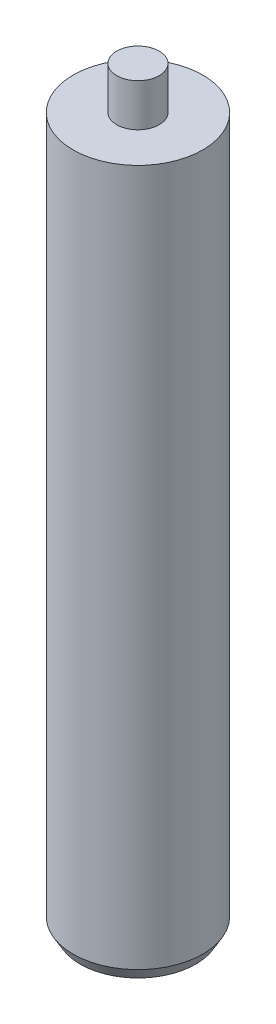
ISO-10303-21;
HEADER;
FILE_DESCRIPTION(('STEP AP214'),'2;1');
FILE_NAME('part.step','',(''),(''),'','','');
FILE_SCHEMA(('AUTOMOTIVE_DESIGN { 1 0 10303 214 1 1 1 1 }'));
ENDSEC;
DATA;
#1=APPLICATION_CONTEXT('core data for automotive mechanical design processes');
#2=APPLICATION_PROTOCOL_DEFINITION('international standard','automotive_design',2000,#1);
#3=PRODUCT_CONTEXT('',#1,'mechanical');
#4=PRODUCT('Part','Part','',(#3));
#5=PRODUCT_RELATED_PRODUCT_CATEGORY('part','',(#4));
#6=PRODUCT_DEFINITION_FORMATION('','',#4);
#7=PRODUCT_DEFINITION_CONTEXT('part definition',#1,'design');
#8=PRODUCT_DEFINITION('design','',#6,#7);
#9=PRODUCT_DEFINITION_SHAPE('','',#8);
#10=(LENGTH_UNIT() NAMED_UNIT(*) SI_UNIT(.MILLI.,.METRE.));
#11=(NAMED_UNIT(*) PLANE_ANGLE_UNIT() SI_UNIT($,.RADIAN.));
#12=(NAMED_UNIT(*) SI_UNIT($,.STERADIAN.) SOLID_ANGLE_UNIT());
#13=UNCERTAINTY_MEASURE_WITH_UNIT(LENGTH_MEASURE(1.E-05),#10,'distance_accuracy_value','');
#14=(GEOMETRIC_REPRESENTATION_CONTEXT(3) GLOBAL_UNCERTAINTY_ASSIGNED_CONTEXT((#13)) GLOBAL_UNIT_ASSIGNED_CONTEXT((#10,
#11,#12)) REPRESENTATION_CONTEXT('',''));
#15=CARTESIAN_POINT('',(0.,0.,0.));
#16=DIRECTION('',(0.,0.,1.));
#17=DIRECTION('',(1.,0.,0.));
#18=AXIS2_PLACEMENT_3D('',#15,#16,#17);
#19=CARTESIAN_POINT('',(0.,100.,0.));
#20=DIRECTION('',(0.,-1.,0.));
#21=DIRECTION('',(0.,0.,-1.));
#22=AXIS2_PLACEMENT_3D('',#19,#20,#21);
#23=CYLINDRICAL_SURFACE('',#22,9.15);
#24=CARTESIAN_POINT('',(0.,1.73205080756884,0.));
#25=DIRECTION('',(0.,1.,0.));
#26=DIRECTION('',(0.,0.,1.));
#27=AXIS2_PLACEMENT_3D('',#24,#25,#26);
#28=CIRCLE('',#27,9.15);
#29=CARTESIAN_POINT('',(0.,1.73205080756884,9.15));
#30=VERTEX_POINT('',#29);
#31=EDGE_CURVE('E45',#30,#30,#28,.T.);
#32=ORIENTED_EDGE('',*,*,#31,.T.);
#33=EDGE_LOOP('',(#32));
#34=FACE_BOUND('',#33,.T.);
#35=CARTESIAN_POINT('',(0.,100.,0.));
#36=DIRECTION('',(0.,1.,0.));
#37=DIRECTION('',(0.,0.,1.));
#38=AXIS2_PLACEMENT_3D('',#35,#36,#37);
#39=CIRCLE('',#38,9.15);
#40=CARTESIAN_POINT('',(0.,100.,9.15));
#41=VERTEX_POINT('',#40);
#42=EDGE_CURVE('E53',#41,#41,#39,.T.);
#43=ORIENTED_EDGE('',*,*,#42,.F.);
#44=EDGE_LOOP('',(#43));
#45=FACE_BOUND('',#44,.T.);
#46=ADVANCED_FACE('F37',(#34,#45),#23,.T.);
#47=CARTESIAN_POINT('',(0.,100.,0.));
#48=DIRECTION('',(0.,1.,0.));
#49=DIRECTION('',(0.,0.,1.));
#50=AXIS2_PLACEMENT_3D('',#47,#48,#49);
#51=PLANE('',#50);
#52=CARTESIAN_POINT('',(0.,100.,0.));
#53=DIRECTION('',(0.,1.,0.));
#54=DIRECTION('',(0.,0.,1.));
#55=AXIS2_PLACEMENT_3D('',#52,#53,#54);
#56=CIRCLE('',#55,3.);
#57=CARTESIAN_POINT('',(0.,100.,3.));
#58=VERTEX_POINT('',#57);
#59=EDGE_CURVE('E49',#58,#58,#56,.T.);
#60=ORIENTED_EDGE('',*,*,#59,.F.);
#61=EDGE_LOOP('',(#60));
#62=FACE_BOUND('',#61,.T.);
#63=ORIENTED_EDGE('',*,*,#42,.T.);
#64=EDGE_LOOP('',(#63));
#65=FACE_BOUND('',#64,.T.);
#66=ADVANCED_FACE('F71',(#62,#65),#51,.T.);
#67=CARTESIAN_POINT('',(0.,0.,0.));
#68=DIRECTION('',(0.,1.,0.));
#69=DIRECTION('',(0.,0.,1.));
#70=AXIS2_PLACEMENT_3D('',#67,#68,#69);
#71=PLANE('',#70);
#72=CARTESIAN_POINT('',(0.,0.,0.));
#73=DIRECTION('',(0.,1.,0.));
#74=DIRECTION('',(0.,0.,1.));
#75=AXIS2_PLACEMENT_3D('',#72,#73,#74);
#76=CIRCLE('',#75,8.15000000000002);
#77=CARTESIAN_POINT('',(0.,0.,8.15000000000002));
#78=VERTEX_POINT('',#77);
#79=EDGE_CURVE('E10',#78,#78,#76,.F.);
#80=ORIENTED_EDGE('',*,*,#79,.T.);
#81=EDGE_LOOP('',(#80));
#82=FACE_BOUND('',#81,.T.);
#83=ADVANCED_FACE('F67',(#82),#71,.F.);
#84=CARTESIAN_POINT('',(0.,106.,0.));
#85=DIRECTION('',(0.,-1.,0.));
#86=DIRECTION('',(0.,0.,-1.));
#87=AXIS2_PLACEMENT_3D('',#84,#85,#86);
#88=CYLINDRICAL_SURFACE('',#87,3.);
#89=CARTESIAN_POINT('',(0.,106.,0.));
#90=DIRECTION('',(0.,1.,0.));
#91=DIRECTION('',(0.,0.,1.));
#92=AXIS2_PLACEMENT_3D('',#89,#90,#91);
#93=CIRCLE('',#92,3.);
#94=CARTESIAN_POINT('',(0.,106.,3.));
#95=VERTEX_POINT('',#94);
#96=EDGE_CURVE('E57',#95,#95,#93,.T.);
#97=ORIENTED_EDGE('',*,*,#96,.F.);
#98=EDGE_LOOP('',(#97));
#99=FACE_BOUND('',#98,.T.);
#100=ORIENTED_EDGE('',*,*,#59,.T.);
#101=EDGE_LOOP('',(#100));
#102=FACE_BOUND('',#101,.T.);
#103=ADVANCED_FACE('F64',(#99,#102),#88,.T.);
#104=CARTESIAN_POINT('',(0.,106.,0.));
#105=DIRECTION('',(0.,1.,0.));
#106=DIRECTION('',(0.,0.,1.));
#107=AXIS2_PLACEMENT_3D('',#104,#105,#106);
#108=PLANE('',#107);
#109=ORIENTED_EDGE('',*,*,#96,.T.);
#110=EDGE_LOOP('',(#109));
#111=FACE_BOUND('',#110,.T.);
#112=ADVANCED_FACE('F62',(#111),#108,.T.);
#113=CARTESIAN_POINT('',(0.,1.73205080756884,0.));
#114=DIRECTION('',(0.,1.,0.));
#115=DIRECTION('',(0.,0.,1.));
#116=AXIS2_PLACEMENT_3D('',#113,#114,#115);
#117=CONICAL_SURFACE('',#116,9.15,0.523598775598299);
#118=ORIENTED_EDGE('',*,*,#79,.F.);
#119=EDGE_LOOP('',(#118));
#120=FACE_BOUND('',#119,.T.);
#121=ORIENTED_EDGE('',*,*,#31,.F.);
#122=EDGE_LOOP('',(#121));
#123=FACE_BOUND('',#122,.T.);
#124=ADVANCED_FACE('F40',(#120,#123),#117,.T.);
#125=CLOSED_SHELL('',(#46,#66,#83,#103,#112,#124));
#126=MANIFOLD_SOLID_BREP('B2',#125);
#127=ADVANCED_BREP_SHAPE_REPRESENTATION('',(#18,#126),#14);
#128=SHAPE_DEFINITION_REPRESENTATION(#9,#127);
ENDSEC;
END-ISO-10303-21;
